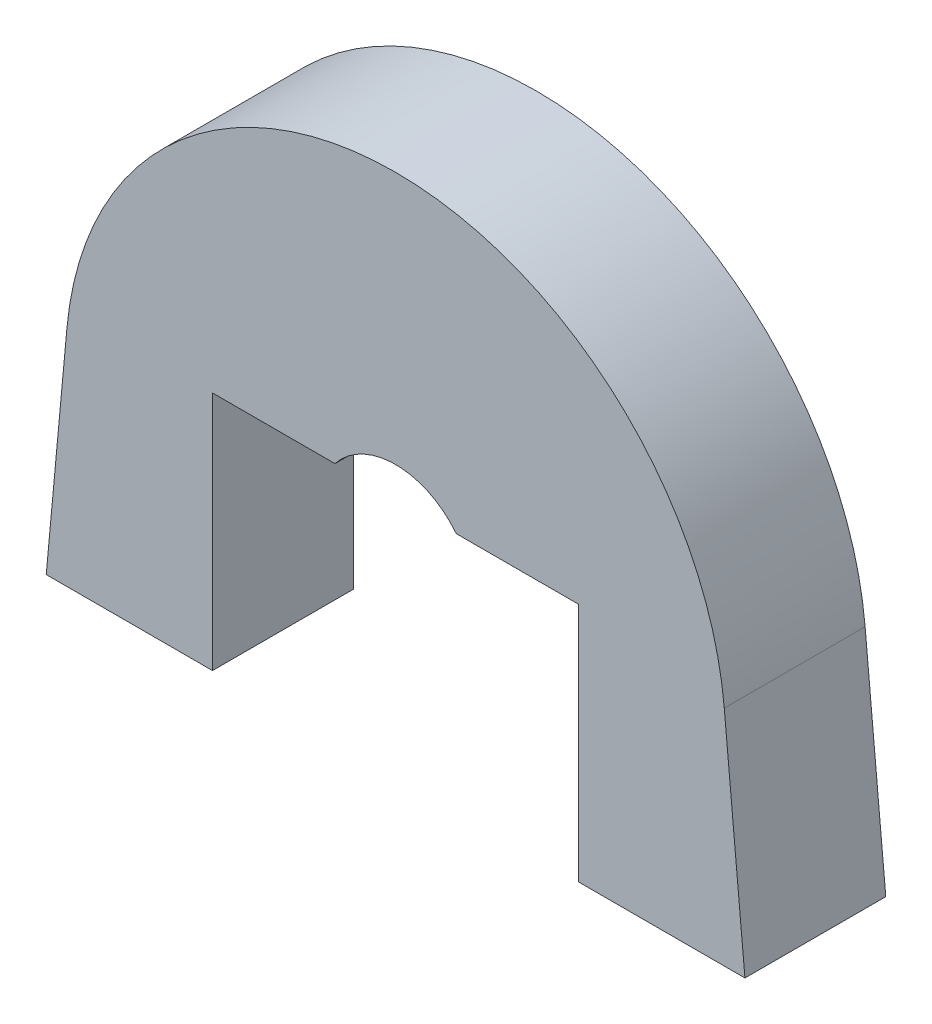
ISO-10303-21;
HEADER;
FILE_DESCRIPTION(('STEP AP214'),'2;1');
FILE_NAME('part.step','',(''),(''),'','','');
FILE_SCHEMA(('AUTOMOTIVE_DESIGN { 1 0 10303 214 1 1 1 1 }'));
ENDSEC;
DATA;
#1=APPLICATION_CONTEXT('core data for automotive mechanical design processes');
#2=APPLICATION_PROTOCOL_DEFINITION('international standard','automotive_design',2000,#1);
#3=PRODUCT_CONTEXT('',#1,'mechanical');
#4=PRODUCT('Part','Part','',(#3));
#5=PRODUCT_RELATED_PRODUCT_CATEGORY('part','',(#4));
#6=PRODUCT_DEFINITION_FORMATION('','',#4);
#7=PRODUCT_DEFINITION_CONTEXT('part definition',#1,'design');
#8=PRODUCT_DEFINITION('design','',#6,#7);
#9=PRODUCT_DEFINITION_SHAPE('','',#8);
#10=(LENGTH_UNIT() NAMED_UNIT(*) SI_UNIT(.MILLI.,.METRE.));
#11=(NAMED_UNIT(*) PLANE_ANGLE_UNIT() SI_UNIT($,.RADIAN.));
#12=(NAMED_UNIT(*) SI_UNIT($,.STERADIAN.) SOLID_ANGLE_UNIT());
#13=UNCERTAINTY_MEASURE_WITH_UNIT(LENGTH_MEASURE(1.E-05),#10,'distance_accuracy_value','');
#14=(GEOMETRIC_REPRESENTATION_CONTEXT(3) GLOBAL_UNCERTAINTY_ASSIGNED_CONTEXT((#13)) GLOBAL_UNIT_ASSIGNED_CONTEXT((#10,
#11,#12)) REPRESENTATION_CONTEXT('',''));
#15=CARTESIAN_POINT('',(0.,0.,0.));
#16=DIRECTION('',(0.,0.,1.));
#17=DIRECTION('',(1.,0.,0.));
#18=AXIS2_PLACEMENT_3D('',#15,#16,#17);
#19=CARTESIAN_POINT('',(0.,0.,3.2));
#20=DIRECTION('',(0.,0.,-1.));
#21=DIRECTION('',(-1.,0.,0.));
#22=AXIS2_PLACEMENT_3D('',#19,#20,#21);
#23=CYLINDRICAL_SURFACE('',#22,3.5);
#24=CARTESIAN_POINT('',(0.,0.,-3.2));
#25=DIRECTION('',(0.,0.,-1.));
#26=DIRECTION('',(1.,0.,0.));
#27=AXIS2_PLACEMENT_3D('',#24,#25,#26);
#28=CIRCLE('',#27,3.5);
#29=CARTESIAN_POINT('',(-2.75608675315569,2.15730985467543,-3.2));
#30=VERTEX_POINT('',#29);
#31=CARTESIAN_POINT('',(2.75608675315569,2.15730985467543,-3.2));
#32=VERTEX_POINT('',#31);
#33=EDGE_CURVE('E163',#30,#32,#28,.T.);
#34=ORIENTED_EDGE('',*,*,#33,.T.);
#35=DIRECTION('',(0.,0.,-1.));
#36=VECTOR('',#35,1.);
#37=CARTESIAN_POINT('',(2.75608675315569,2.15730985467543,3.2));
#38=LINE('',#37,#36);
#39=CARTESIAN_POINT('',(2.75608675315569,2.15730985467543,3.2));
#40=VERTEX_POINT('',#39);
#41=EDGE_CURVE('E11',#40,#32,#38,.T.);
#42=ORIENTED_EDGE('',*,*,#41,.F.);
#43=CARTESIAN_POINT('',(0.,0.,3.2));
#44=DIRECTION('',(0.,0.,-1.));
#45=DIRECTION('',(1.,0.,0.));
#46=AXIS2_PLACEMENT_3D('',#43,#44,#45);
#47=CIRCLE('',#46,3.5);
#48=CARTESIAN_POINT('',(-2.75608675315569,2.15730985467543,3.2));
#49=VERTEX_POINT('',#48);
#50=EDGE_CURVE('E192',#49,#40,#47,.T.);
#51=ORIENTED_EDGE('',*,*,#50,.F.);
#52=DIRECTION('',(0.,0.,-1.));
#53=VECTOR('',#52,1.);
#54=CARTESIAN_POINT('',(-2.75608675315569,2.15730985467543,3.2));
#55=LINE('',#54,#53);
#56=EDGE_CURVE('E159',#49,#30,#55,.T.);
#57=ORIENTED_EDGE('',*,*,#56,.T.);
#58=EDGE_LOOP('',(#34,#42,#51,#57));
#59=FACE_BOUND('',#58,.T.);
#60=ADVANCED_FACE('F42',(#59),#23,.F.);
#61=CARTESIAN_POINT('',(8.32,2.15730985467543,3.2));
#62=DIRECTION('',(0.,1.,0.));
#63=DIRECTION('',(-1.,0.,0.));
#64=AXIS2_PLACEMENT_3D('',#61,#62,#63);
#65=PLANE('',#64);
#66=DIRECTION('',(1.,0.,0.));
#67=VECTOR('',#66,1.);
#68=CARTESIAN_POINT('',(8.32,2.15730985467543,-3.2));
#69=LINE('',#68,#67);
#70=CARTESIAN_POINT('',(8.32,2.15730985467543,-3.2));
#71=VERTEX_POINT('',#70);
#72=EDGE_CURVE('E167',#32,#71,#69,.T.);
#73=ORIENTED_EDGE('',*,*,#72,.T.);
#74=DIRECTION('',(0.,0.,-1.));
#75=VECTOR('',#74,1.);
#76=CARTESIAN_POINT('',(8.32,2.15730985467543,3.2));
#77=LINE('',#76,#75);
#78=CARTESIAN_POINT('',(8.32,2.15730985467543,3.2));
#79=VERTEX_POINT('',#78);
#80=EDGE_CURVE('E51',#79,#71,#77,.T.);
#81=ORIENTED_EDGE('',*,*,#80,.F.);
#82=DIRECTION('',(1.,0.,0.));
#83=VECTOR('',#82,1.);
#84=CARTESIAN_POINT('',(8.32,2.15730985467543,3.2));
#85=LINE('',#84,#83);
#86=EDGE_CURVE('E114',#40,#79,#85,.T.);
#87=ORIENTED_EDGE('',*,*,#86,.F.);
#88=ORIENTED_EDGE('',*,*,#41,.T.);
#89=EDGE_LOOP('',(#73,#81,#87,#88));
#90=FACE_BOUND('',#89,.T.);
#91=ADVANCED_FACE('F291',(#90),#65,.F.);
#92=CARTESIAN_POINT('',(8.32,-8.77,3.2));
#93=DIRECTION('',(1.,0.,0.));
#94=DIRECTION('',(0.,1.,0.));
#95=AXIS2_PLACEMENT_3D('',#92,#93,#94);
#96=PLANE('',#95);
#97=DIRECTION('',(0.,-1.,0.));
#98=VECTOR('',#97,1.);
#99=CARTESIAN_POINT('',(8.32,-8.77,-3.2));
#100=LINE('',#99,#98);
#101=CARTESIAN_POINT('',(8.32,-8.77,-3.2));
#102=VERTEX_POINT('',#101);
#103=EDGE_CURVE('E171',#71,#102,#100,.T.);
#104=ORIENTED_EDGE('',*,*,#103,.T.);
#105=DIRECTION('',(0.,0.,-1.));
#106=VECTOR('',#105,1.);
#107=CARTESIAN_POINT('',(8.32,-8.77,3.2));
#108=LINE('',#107,#106);
#109=CARTESIAN_POINT('',(8.32,-8.77,3.2));
#110=VERTEX_POINT('',#109);
#111=EDGE_CURVE('E211',#110,#102,#108,.T.);
#112=ORIENTED_EDGE('',*,*,#111,.F.);
#113=DIRECTION('',(0.,-1.,0.));
#114=VECTOR('',#113,1.);
#115=CARTESIAN_POINT('',(8.32,-8.77,3.2));
#116=LINE('',#115,#114);
#117=EDGE_CURVE('E221',#79,#110,#116,.T.);
#118=ORIENTED_EDGE('',*,*,#117,.F.);
#119=ORIENTED_EDGE('',*,*,#80,.T.);
#120=EDGE_LOOP('',(#104,#112,#118,#119));
#121=FACE_BOUND('',#120,.T.);
#122=ADVANCED_FACE('F219',(#121),#96,.F.);
#123=CARTESIAN_POINT('',(15.875,-8.77,3.2));
#124=DIRECTION('',(0.,1.,0.));
#125=DIRECTION('',(-1.,0.,0.));
#126=AXIS2_PLACEMENT_3D('',#123,#124,#125);
#127=PLANE('',#126);
#128=CARTESIAN_POINT('',(12.7,-8.77,0.));
#129=DIRECTION('',(0.,-1.,0.));
#130=DIRECTION('',(-1.,0.,0.));
#131=AXIS2_PLACEMENT_3D('',#128,#129,#130);
#132=CIRCLE('',#131,1.5);
#133=CARTESIAN_POINT('',(11.2,-8.77,0.));
#134=VERTEX_POINT('',#133);
#135=EDGE_CURVE('E254',#134,#134,#132,.T.);
#136=ORIENTED_EDGE('',*,*,#135,.F.);
#137=EDGE_LOOP('',(#136));
#138=FACE_BOUND('',#137,.T.);
#139=DIRECTION('',(1.,0.,0.));
#140=VECTOR('',#139,1.);
#141=CARTESIAN_POINT('',(15.875,-8.77,-3.2));
#142=LINE('',#141,#140);
#143=CARTESIAN_POINT('',(15.875,-8.77,-3.2));
#144=VERTEX_POINT('',#143);
#145=EDGE_CURVE('E174',#102,#144,#142,.T.);
#146=ORIENTED_EDGE('',*,*,#145,.T.);
#147=DIRECTION('',(0.,0.,-1.));
#148=VECTOR('',#147,1.);
#149=CARTESIAN_POINT('',(15.875,-8.77,3.2));
#150=LINE('',#149,#148);
#151=CARTESIAN_POINT('',(15.875,-8.77,3.2));
#152=VERTEX_POINT('',#151);
#153=EDGE_CURVE('E207',#152,#144,#150,.T.);
#154=ORIENTED_EDGE('',*,*,#153,.F.);
#155=DIRECTION('',(1.,0.,0.));
#156=VECTOR('',#155,1.);
#157=CARTESIAN_POINT('',(15.875,-8.77,3.2));
#158=LINE('',#157,#156);
#159=EDGE_CURVE('E240',#110,#152,#158,.T.);
#160=ORIENTED_EDGE('',*,*,#159,.F.);
#161=ORIENTED_EDGE('',*,*,#111,.T.);
#162=EDGE_LOOP('',(#146,#154,#160,#161));
#163=FACE_BOUND('',#162,.T.);
#164=ADVANCED_FACE('F230',(#138,#163),#127,.F.);
#165=CARTESIAN_POINT('',(15.875,-8.77,3.2));
#166=DIRECTION('',(-0.995751474685951,-0.0920814892405319,0.));
#167=DIRECTION('',(0.0920814892405319,-0.995751474685951,0.));
#168=AXIS2_PLACEMENT_3D('',#165,#166,#167);
#169=PLANE('',#168);
#170=DIRECTION('',(-0.0920814892405319,0.995751474685951,0.));
#171=VECTOR('',#170,1.);
#172=CARTESIAN_POINT('',(15.875,-8.77,-3.2));
#173=LINE('',#172,#171);
#174=CARTESIAN_POINT('',(14.9362721202893,1.38122233860799,-3.2));
#175=VERTEX_POINT('',#174);
#176=EDGE_CURVE('E177',#144,#175,#173,.T.);
#177=ORIENTED_EDGE('',*,*,#176,.T.);
#178=DIRECTION('',(0.,0.,-1.));
#179=VECTOR('',#178,1.);
#180=CARTESIAN_POINT('',(14.9362721202893,1.38122233860799,3.2));
#181=LINE('',#180,#179);
#182=CARTESIAN_POINT('',(14.9362721202893,1.38122233860799,3.2));
#183=VERTEX_POINT('',#182);
#184=EDGE_CURVE('E203',#183,#175,#181,.T.);
#185=ORIENTED_EDGE('',*,*,#184,.F.);
#186=DIRECTION('',(-0.0920814892405319,0.995751474685951,0.));
#187=VECTOR('',#186,1.);
#188=CARTESIAN_POINT('',(15.875,-8.77,3.2));
#189=LINE('',#188,#187);
#190=EDGE_CURVE('E236',#152,#183,#189,.T.);
#191=ORIENTED_EDGE('',*,*,#190,.F.);
#192=ORIENTED_EDGE('',*,*,#153,.T.);
#193=EDGE_LOOP('',(#177,#185,#191,#192));
#194=FACE_BOUND('',#193,.T.);
#195=ADVANCED_FACE('F234',(#194),#169,.F.);
#196=CARTESIAN_POINT('',(0.,0.,3.2));
#197=DIRECTION('',(0.,0.,-1.));
#198=DIRECTION('',(-1.,0.,0.));
#199=AXIS2_PLACEMENT_3D('',#196,#197,#198);
#200=CYLINDRICAL_SURFACE('',#199,15.);
#201=CARTESIAN_POINT('',(0.,0.,-3.2));
#202=DIRECTION('',(0.,0.,1.));
#203=DIRECTION('',(1.,0.,0.));
#204=AXIS2_PLACEMENT_3D('',#201,#202,#203);
#205=CIRCLE('',#204,15.);
#206=CARTESIAN_POINT('',(-14.9362721202893,1.38122233860799,-3.2));
#207=VERTEX_POINT('',#206);
#208=EDGE_CURVE('E180',#175,#207,#205,.T.);
#209=ORIENTED_EDGE('',*,*,#208,.T.);
#210=DIRECTION('',(0.,0.,-1.));
#211=VECTOR('',#210,1.);
#212=CARTESIAN_POINT('',(-14.9362721202893,1.38122233860799,3.2));
#213=LINE('',#212,#211);
#214=CARTESIAN_POINT('',(-14.9362721202893,1.38122233860799,3.2));
#215=VERTEX_POINT('',#214);
#216=EDGE_CURVE('E199',#215,#207,#213,.T.);
#217=ORIENTED_EDGE('',*,*,#216,.F.);
#218=CARTESIAN_POINT('',(0.,0.,3.2));
#219=DIRECTION('',(0.,0.,1.));
#220=DIRECTION('',(1.,0.,0.));
#221=AXIS2_PLACEMENT_3D('',#218,#219,#220);
#222=CIRCLE('',#221,15.);
#223=EDGE_CURVE('E239',#183,#215,#222,.T.);
#224=ORIENTED_EDGE('',*,*,#223,.F.);
#225=ORIENTED_EDGE('',*,*,#184,.T.);
#226=EDGE_LOOP('',(#209,#217,#224,#225));
#227=FACE_BOUND('',#226,.T.);
#228=ADVANCED_FACE('F287',(#227),#200,.T.);
#229=CARTESIAN_POINT('',(-15.875,-8.77,3.2));
#230=DIRECTION('',(0.995751474685951,-0.0920814892405319,0.));
#231=DIRECTION('',(0.0920814892405319,0.995751474685951,0.));
#232=AXIS2_PLACEMENT_3D('',#229,#230,#231);
#233=PLANE('',#232);
#234=DIRECTION('',(-0.0920814892405319,-0.995751474685951,0.));
#235=VECTOR('',#234,1.);
#236=CARTESIAN_POINT('',(-15.875,-8.77,-3.2));
#237=LINE('',#236,#235);
#238=CARTESIAN_POINT('',(-15.875,-8.77,-3.2));
#239=VERTEX_POINT('',#238);
#240=EDGE_CURVE('E183',#207,#239,#237,.T.);
#241=ORIENTED_EDGE('',*,*,#240,.T.);
#242=DIRECTION('',(0.,0.,-1.));
#243=VECTOR('',#242,1.);
#244=CARTESIAN_POINT('',(-15.875,-8.77,3.2));
#245=LINE('',#244,#243);
#246=CARTESIAN_POINT('',(-15.875,-8.77,3.2));
#247=VERTEX_POINT('',#246);
#248=EDGE_CURVE('E152',#247,#239,#245,.T.);
#249=ORIENTED_EDGE('',*,*,#248,.F.);
#250=DIRECTION('',(-0.0920814892405319,-0.995751474685951,0.));
#251=VECTOR('',#250,1.);
#252=CARTESIAN_POINT('',(-15.875,-8.77,3.2));
#253=LINE('',#252,#251);
#254=EDGE_CURVE('E141',#215,#247,#253,.T.);
#255=ORIENTED_EDGE('',*,*,#254,.F.);
#256=ORIENTED_EDGE('',*,*,#216,.T.);
#257=EDGE_LOOP('',(#241,#249,#255,#256));
#258=FACE_BOUND('',#257,.T.);
#259=ADVANCED_FACE('F279',(#258),#233,.F.);
#260=CARTESIAN_POINT('',(-15.875,-8.77,3.2));
#261=DIRECTION('',(0.,1.,0.));
#262=DIRECTION('',(-1.,0.,0.));
#263=AXIS2_PLACEMENT_3D('',#260,#261,#262);
#264=PLANE('',#263);
#265=CARTESIAN_POINT('',(-12.7,-8.77,0.));
#266=DIRECTION('',(0.,-1.,0.));
#267=DIRECTION('',(1.,0.,0.));
#268=AXIS2_PLACEMENT_3D('',#265,#266,#267);
#269=CIRCLE('',#268,1.5);
#270=CARTESIAN_POINT('',(-11.2,-8.77,0.));
#271=VERTEX_POINT('',#270);
#272=EDGE_CURVE('E262',#271,#271,#269,.T.);
#273=ORIENTED_EDGE('',*,*,#272,.F.);
#274=EDGE_LOOP('',(#273));
#275=FACE_BOUND('',#274,.T.);
#276=DIRECTION('',(1.,0.,0.));
#277=VECTOR('',#276,1.);
#278=CARTESIAN_POINT('',(-15.875,-8.77,-3.2));
#279=LINE('',#278,#277);
#280=CARTESIAN_POINT('',(-8.32,-8.77,-3.2));
#281=VERTEX_POINT('',#280);
#282=EDGE_CURVE('E150',#239,#281,#279,.T.);
#283=ORIENTED_EDGE('',*,*,#282,.T.);
#284=DIRECTION('',(0.,0.,-1.));
#285=VECTOR('',#284,1.);
#286=CARTESIAN_POINT('',(-8.32,-8.77,3.2));
#287=LINE('',#286,#285);
#288=CARTESIAN_POINT('',(-8.32,-8.77,3.2));
#289=VERTEX_POINT('',#288);
#290=EDGE_CURVE('E147',#289,#281,#287,.T.);
#291=ORIENTED_EDGE('',*,*,#290,.F.);
#292=DIRECTION('',(1.,0.,0.));
#293=VECTOR('',#292,1.);
#294=CARTESIAN_POINT('',(-15.875,-8.77,3.2));
#295=LINE('',#294,#293);
#296=EDGE_CURVE('E135',#247,#289,#295,.T.);
#297=ORIENTED_EDGE('',*,*,#296,.F.);
#298=ORIENTED_EDGE('',*,*,#248,.T.);
#299=EDGE_LOOP('',(#283,#291,#297,#298));
#300=FACE_BOUND('',#299,.T.);
#301=ADVANCED_FACE('F148',(#275,#300),#264,.F.);
#302=CARTESIAN_POINT('',(-8.32,-8.77,3.2));
#303=DIRECTION('',(-1.,0.,0.));
#304=DIRECTION('',(0.,-1.,0.));
#305=AXIS2_PLACEMENT_3D('',#302,#303,#304);
#306=PLANE('',#305);
#307=DIRECTION('',(0.,1.,0.));
#308=VECTOR('',#307,1.);
#309=CARTESIAN_POINT('',(-8.32,-8.77,-3.2));
#310=LINE('',#309,#308);
#311=CARTESIAN_POINT('',(-8.32,2.15730985467543,-3.2));
#312=VERTEX_POINT('',#311);
#313=EDGE_CURVE('E100',#281,#312,#310,.T.);
#314=ORIENTED_EDGE('',*,*,#313,.T.);
#315=DIRECTION('',(0.,0.,-1.));
#316=VECTOR('',#315,1.);
#317=CARTESIAN_POINT('',(-8.32,2.15730985467543,3.2));
#318=LINE('',#317,#316);
#319=CARTESIAN_POINT('',(-8.32,2.15730985467543,3.2));
#320=VERTEX_POINT('',#319);
#321=EDGE_CURVE('E153',#320,#312,#318,.T.);
#322=ORIENTED_EDGE('',*,*,#321,.F.);
#323=DIRECTION('',(0.,1.,0.));
#324=VECTOR('',#323,1.);
#325=CARTESIAN_POINT('',(-8.32,-8.77,3.2));
#326=LINE('',#325,#324);
#327=EDGE_CURVE('E139',#289,#320,#326,.T.);
#328=ORIENTED_EDGE('',*,*,#327,.F.);
#329=ORIENTED_EDGE('',*,*,#290,.T.);
#330=EDGE_LOOP('',(#314,#322,#328,#329));
#331=FACE_BOUND('',#330,.T.);
#332=ADVANCED_FACE('F155',(#331),#306,.F.);
#333=CARTESIAN_POINT('',(-8.32,2.15730985467543,3.2));
#334=DIRECTION('',(0.,1.,0.));
#335=DIRECTION('',(-1.,0.,0.));
#336=AXIS2_PLACEMENT_3D('',#333,#334,#335);
#337=PLANE('',#336);
#338=DIRECTION('',(1.,0.,0.));
#339=VECTOR('',#338,1.);
#340=CARTESIAN_POINT('',(-8.32,2.15730985467543,-3.2));
#341=LINE('',#340,#339);
#342=EDGE_CURVE('E106',#312,#30,#341,.T.);
#343=ORIENTED_EDGE('',*,*,#342,.T.);
#344=ORIENTED_EDGE('',*,*,#56,.F.);
#345=DIRECTION('',(1.,0.,0.));
#346=VECTOR('',#345,1.);
#347=CARTESIAN_POINT('',(-8.32,2.15730985467543,3.2));
#348=LINE('',#347,#346);
#349=EDGE_CURVE('E59',#320,#49,#348,.T.);
#350=ORIENTED_EDGE('',*,*,#349,.F.);
#351=ORIENTED_EDGE('',*,*,#321,.T.);
#352=EDGE_LOOP('',(#343,#344,#350,#351));
#353=FACE_BOUND('',#352,.T.);
#354=ADVANCED_FACE('F285',(#353),#337,.F.);
#355=CARTESIAN_POINT('',(0.,0.,3.2));
#356=DIRECTION('',(0.,0.,1.));
#357=DIRECTION('',(1.,0.,0.));
#358=AXIS2_PLACEMENT_3D('',#355,#356,#357);
#359=PLANE('',#358);
#360=ORIENTED_EDGE('',*,*,#50,.T.);
#361=ORIENTED_EDGE('',*,*,#86,.T.);
#362=ORIENTED_EDGE('',*,*,#117,.T.);
#363=ORIENTED_EDGE('',*,*,#159,.T.);
#364=ORIENTED_EDGE('',*,*,#190,.T.);
#365=ORIENTED_EDGE('',*,*,#223,.T.);
#366=ORIENTED_EDGE('',*,*,#254,.T.);
#367=ORIENTED_EDGE('',*,*,#296,.T.);
#368=ORIENTED_EDGE('',*,*,#327,.T.);
#369=ORIENTED_EDGE('',*,*,#349,.T.);
#370=EDGE_LOOP('',(#360,#361,#362,#363,#364,#365,#366,#367,#368,#369));
#371=FACE_BOUND('',#370,.T.);
#372=ADVANCED_FACE('F137',(#371),#359,.T.);
#373=CARTESIAN_POINT('',(0.,0.,-3.2));
#374=DIRECTION('',(0.,0.,1.));
#375=DIRECTION('',(1.,0.,0.));
#376=AXIS2_PLACEMENT_3D('',#373,#374,#375);
#377=PLANE('',#376);
#378=ORIENTED_EDGE('',*,*,#33,.F.);
#379=ORIENTED_EDGE('',*,*,#342,.F.);
#380=ORIENTED_EDGE('',*,*,#313,.F.);
#381=ORIENTED_EDGE('',*,*,#282,.F.);
#382=ORIENTED_EDGE('',*,*,#240,.F.);
#383=ORIENTED_EDGE('',*,*,#208,.F.);
#384=ORIENTED_EDGE('',*,*,#176,.F.);
#385=ORIENTED_EDGE('',*,*,#145,.F.);
#386=ORIENTED_EDGE('',*,*,#103,.F.);
#387=ORIENTED_EDGE('',*,*,#72,.F.);
#388=EDGE_LOOP('',(#378,#379,#380,#381,#382,#383,#384,#385,#386,#387));
#389=FACE_BOUND('',#388,.T.);
#390=ADVANCED_FACE('F225',(#389),#377,.F.);
#391=CARTESIAN_POINT('',(-12.7,-3.77,0.));
#392=DIRECTION('',(0.,-1.,0.));
#393=DIRECTION('',(1.,0.,0.));
#394=AXIS2_PLACEMENT_3D('',#391,#392,#393);
#395=CYLINDRICAL_SURFACE('',#394,1.5);
#396=CARTESIAN_POINT('',(-12.7,-3.77,0.));
#397=DIRECTION('',(0.,-1.,0.));
#398=DIRECTION('',(1.,0.,0.));
#399=AXIS2_PLACEMENT_3D('',#396,#397,#398);
#400=CIRCLE('',#399,1.5);
#401=CARTESIAN_POINT('',(-11.2,-3.77,0.));
#402=VERTEX_POINT('',#401);
#403=EDGE_CURVE('E168',#402,#402,#400,.T.);
#404=ORIENTED_EDGE('',*,*,#403,.F.);
#405=EDGE_LOOP('',(#404));
#406=FACE_BOUND('',#405,.T.);
#407=ORIENTED_EDGE('',*,*,#272,.T.);
#408=EDGE_LOOP('',(#407));
#409=FACE_BOUND('',#408,.T.);
#410=ADVANCED_FACE('F272',(#406,#409),#395,.F.);
#411=CARTESIAN_POINT('',(-12.7,-3.77,0.));
#412=DIRECTION('',(0.,-1.,0.));
#413=DIRECTION('',(1.,0.,0.));
#414=AXIS2_PLACEMENT_3D('',#411,#412,#413);
#415=PLANE('',#414);
#416=ORIENTED_EDGE('',*,*,#403,.T.);
#417=EDGE_LOOP('',(#416));
#418=FACE_BOUND('',#417,.T.);
#419=ADVANCED_FACE('F270',(#418),#415,.T.);
#420=CARTESIAN_POINT('',(12.7,-3.77,0.));
#421=DIRECTION('',(0.,-1.,0.));
#422=DIRECTION('',(1.,0.,0.));
#423=AXIS2_PLACEMENT_3D('',#420,#421,#422);
#424=CYLINDRICAL_SURFACE('',#423,1.5);
#425=CARTESIAN_POINT('',(12.7,-3.77,0.));
#426=DIRECTION('',(0.,-1.,0.));
#427=DIRECTION('',(-1.,0.,0.));
#428=AXIS2_PLACEMENT_3D('',#425,#426,#427);
#429=CIRCLE('',#428,1.5);
#430=CARTESIAN_POINT('',(11.2,-3.77,0.));
#431=VERTEX_POINT('',#430);
#432=EDGE_CURVE('E258',#431,#431,#429,.T.);
#433=ORIENTED_EDGE('',*,*,#432,.F.);
#434=EDGE_LOOP('',(#433));
#435=FACE_BOUND('',#434,.T.);
#436=ORIENTED_EDGE('',*,*,#135,.T.);
#437=EDGE_LOOP('',(#436));
#438=FACE_BOUND('',#437,.T.);
#439=ADVANCED_FACE('F389',(#435,#438),#424,.F.);
#440=CARTESIAN_POINT('',(12.7,-3.77,0.));
#441=DIRECTION('',(0.,1.,0.));
#442=DIRECTION('',(-1.,0.,0.));
#443=AXIS2_PLACEMENT_3D('',#440,#441,#442);
#444=PLANE('',#443);
#445=ORIENTED_EDGE('',*,*,#432,.T.);
#446=EDGE_LOOP('',(#445));
#447=FACE_BOUND('',#446,.T.);
#448=ADVANCED_FACE('F398',(#447),#444,.F.);
#449=CLOSED_SHELL('',(#60,#91,#122,#164,#195,#228,#259,#301,#332,#354,#372,#390,#410,#419,#439,#448));
#450=MANIFOLD_SOLID_BREP('B2',#449);
#451=ADVANCED_BREP_SHAPE_REPRESENTATION('',(#18,#450),#14);
#452=SHAPE_DEFINITION_REPRESENTATION(#9,#451);
ENDSEC;
END-ISO-10303-21;
